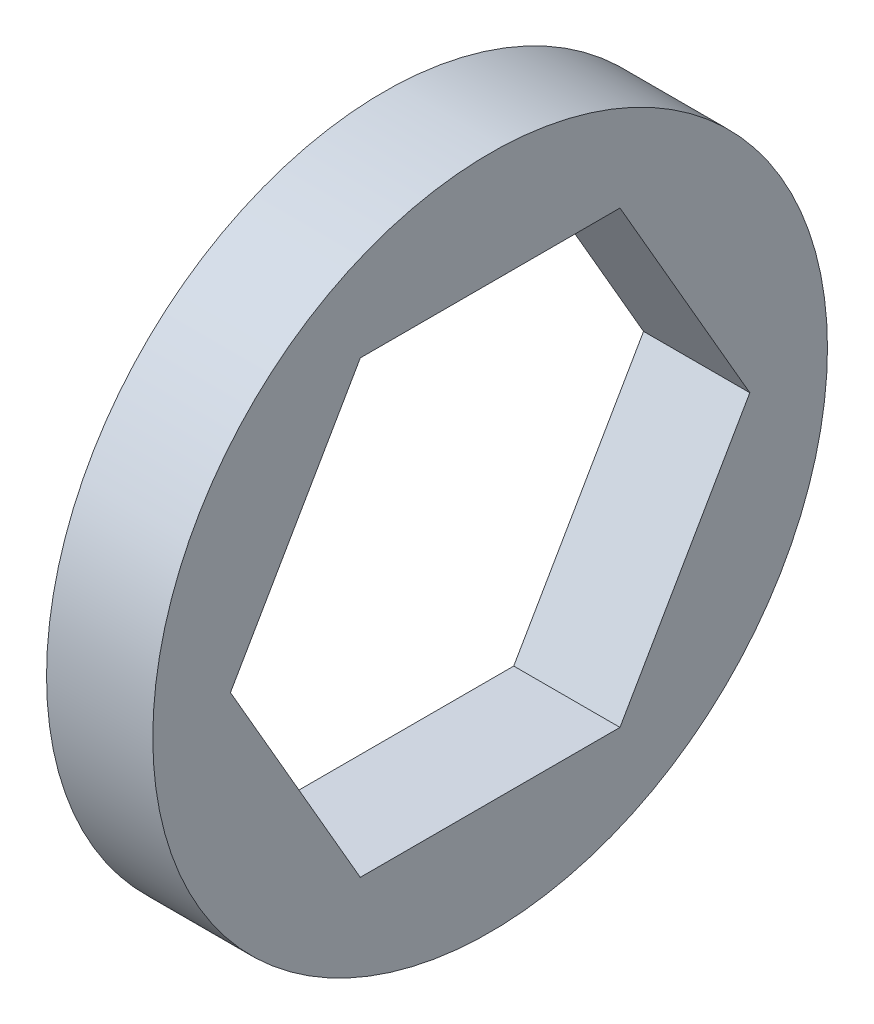
ISO-10303-21;
HEADER;
FILE_DESCRIPTION(('STEP AP214'),'2;1');
FILE_NAME('part.step','',(''),(''),'','','');
FILE_SCHEMA(('AUTOMOTIVE_DESIGN { 1 0 10303 214 1 1 1 1 }'));
ENDSEC;
DATA;
#1=APPLICATION_CONTEXT('core data for automotive mechanical design processes');
#2=APPLICATION_PROTOCOL_DEFINITION('international standard','automotive_design',2000,#1);
#3=PRODUCT_CONTEXT('',#1,'mechanical');
#4=PRODUCT('Part','Part','',(#3));
#5=PRODUCT_RELATED_PRODUCT_CATEGORY('part','',(#4));
#6=PRODUCT_DEFINITION_FORMATION('','',#4);
#7=PRODUCT_DEFINITION_CONTEXT('part definition',#1,'design');
#8=PRODUCT_DEFINITION('design','',#6,#7);
#9=PRODUCT_DEFINITION_SHAPE('','',#8);
#10=(LENGTH_UNIT() NAMED_UNIT(*) SI_UNIT(.MILLI.,.METRE.));
#11=(NAMED_UNIT(*) PLANE_ANGLE_UNIT() SI_UNIT($,.RADIAN.));
#12=(NAMED_UNIT(*) SI_UNIT($,.STERADIAN.) SOLID_ANGLE_UNIT());
#13=UNCERTAINTY_MEASURE_WITH_UNIT(LENGTH_MEASURE(1.E-05),#10,'distance_accuracy_value','');
#14=(GEOMETRIC_REPRESENTATION_CONTEXT(3) GLOBAL_UNCERTAINTY_ASSIGNED_CONTEXT((#13)) GLOBAL_UNIT_ASSIGNED_CONTEXT((#10,
#11,#12)) REPRESENTATION_CONTEXT('',''));
#15=CARTESIAN_POINT('',(0.,0.,0.));
#16=DIRECTION('',(0.,0.,1.));
#17=DIRECTION('',(1.,0.,0.));
#18=AXIS2_PLACEMENT_3D('',#15,#16,#17);
#19=CARTESIAN_POINT('',(1.5,0.,0.));
#20=DIRECTION('',(1.,0.,0.));
#21=DIRECTION('',(0.,0.,-1.));
#22=AXIS2_PLACEMENT_3D('',#19,#20,#21);
#23=PLANE('',#22);
#24=CARTESIAN_POINT('',(1.5,0.,0.));
#25=DIRECTION('',(1.,0.,0.));
#26=DIRECTION('',(0.,0.,-1.));
#27=AXIS2_PLACEMENT_3D('',#24,#25,#26);
#28=CIRCLE('',#27,9.52500000000001);
#29=CARTESIAN_POINT('',(1.5,0.,-9.52500000000001));
#30=VERTEX_POINT('',#29);
#31=EDGE_CURVE('E11',#30,#30,#28,.T.);
#32=ORIENTED_EDGE('',*,*,#31,.T.);
#33=EDGE_LOOP('',(#32));
#34=FACE_BOUND('',#33,.T.);
#35=DIRECTION('',(0.,0.866025403784441,0.499999999999996));
#36=VECTOR('',#35,1.);
#37=CARTESIAN_POINT('',(1.5,0.,-7.33234841870806));
#38=LINE('',#37,#36);
#39=CARTESIAN_POINT('',(1.5,0.,-7.33234841870806));
#40=VERTEX_POINT('',#39);
#41=CARTESIAN_POINT('',(1.5,6.35000000000008,-3.66617420935395));
#42=VERTEX_POINT('',#41);
#43=EDGE_CURVE('E95',#40,#42,#38,.T.);
#44=ORIENTED_EDGE('',*,*,#43,.F.);
#45=DIRECTION('',(0.,0.866025403784443,-0.499999999999992));
#46=VECTOR('',#45,1.);
#47=CARTESIAN_POINT('',(1.5,-6.34999999999999,-3.666174209354));
#48=LINE('',#47,#46);
#49=CARTESIAN_POINT('',(1.5,-6.34999999999999,-3.666174209354));
#50=VERTEX_POINT('',#49);
#51=EDGE_CURVE('E87',#50,#40,#48,.T.);
#52=ORIENTED_EDGE('',*,*,#51,.F.);
#53=DIRECTION('',(0.,0.,-1.));
#54=VECTOR('',#53,1.);
#55=CARTESIAN_POINT('',(1.5,-6.34999999999999,3.66617420935417));
#56=LINE('',#55,#54);
#57=CARTESIAN_POINT('',(1.5,-6.34999999999999,3.66617420935417));
#58=VERTEX_POINT('',#57);
#59=EDGE_CURVE('E115',#58,#50,#56,.T.);
#60=ORIENTED_EDGE('',*,*,#59,.F.);
#61=DIRECTION('',(0.,-0.866025403784438,-0.500000000000001));
#62=VECTOR('',#61,1.);
#63=CARTESIAN_POINT('',(1.5,0.,7.33234841870828));
#64=LINE('',#63,#62);
#65=CARTESIAN_POINT('',(1.5,0.,7.33234841870828));
#66=VERTEX_POINT('',#65);
#67=EDGE_CURVE('E113',#66,#58,#64,.T.);
#68=ORIENTED_EDGE('',*,*,#67,.F.);
#69=DIRECTION('',(0.,-0.86602540378444,0.499999999999998));
#70=VECTOR('',#69,1.);
#71=CARTESIAN_POINT('',(1.5,6.35000000000008,3.66617420935411));
#72=LINE('',#71,#70);
#73=CARTESIAN_POINT('',(1.5,6.35000000000008,3.66617420935411));
#74=VERTEX_POINT('',#73);
#75=EDGE_CURVE('E109',#74,#66,#72,.T.);
#76=ORIENTED_EDGE('',*,*,#75,.F.);
#77=DIRECTION('',(0.,0.,1.));
#78=VECTOR('',#77,1.);
#79=CARTESIAN_POINT('',(1.5,6.35000000000008,-3.66617420935395));
#80=LINE('',#79,#78);
#81=EDGE_CURVE('E107',#42,#74,#80,.T.);
#82=ORIENTED_EDGE('',*,*,#81,.F.);
#83=EDGE_LOOP('',(#44,#52,#60,#68,#76,#82));
#84=FACE_BOUND('',#83,.T.);
#85=ADVANCED_FACE('F34',(#34,#84),#23,.T.);
#86=CARTESIAN_POINT('',(-1.5,0.,0.));
#87=DIRECTION('',(1.,0.,0.));
#88=DIRECTION('',(0.,0.,-1.));
#89=AXIS2_PLACEMENT_3D('',#86,#87,#88);
#90=PLANE('',#89);
#91=CARTESIAN_POINT('',(-1.5,0.,0.));
#92=DIRECTION('',(1.,0.,0.));
#93=DIRECTION('',(0.,0.,-1.));
#94=AXIS2_PLACEMENT_3D('',#91,#92,#93);
#95=CIRCLE('',#94,9.52500000000001);
#96=CARTESIAN_POINT('',(-1.5,0.,-9.52500000000001));
#97=VERTEX_POINT('',#96);
#98=EDGE_CURVE('E38',#97,#97,#95,.T.);
#99=ORIENTED_EDGE('',*,*,#98,.F.);
#100=EDGE_LOOP('',(#99));
#101=FACE_BOUND('',#100,.T.);
#102=DIRECTION('',(0.,0.866025403784443,-0.499999999999992));
#103=VECTOR('',#102,1.);
#104=CARTESIAN_POINT('',(-1.5,-6.34999999999999,-3.666174209354));
#105=LINE('',#104,#103);
#106=CARTESIAN_POINT('',(-1.5,-6.34999999999999,-3.666174209354));
#107=VERTEX_POINT('',#106);
#108=CARTESIAN_POINT('',(-1.5,0.,-7.33234841870806));
#109=VERTEX_POINT('',#108);
#110=EDGE_CURVE('E57',#107,#109,#105,.T.);
#111=ORIENTED_EDGE('',*,*,#110,.T.);
#112=DIRECTION('',(0.,0.866025403784441,0.499999999999996));
#113=VECTOR('',#112,1.);
#114=CARTESIAN_POINT('',(-1.5,0.,-7.33234841870806));
#115=LINE('',#114,#113);
#116=CARTESIAN_POINT('',(-1.5,6.35000000000008,-3.66617420935395));
#117=VERTEX_POINT('',#116);
#118=EDGE_CURVE('E102',#109,#117,#115,.T.);
#119=ORIENTED_EDGE('',*,*,#118,.T.);
#120=DIRECTION('',(0.,0.,1.));
#121=VECTOR('',#120,1.);
#122=CARTESIAN_POINT('',(-1.5,6.35000000000008,-3.66617420935395));
#123=LINE('',#122,#121);
#124=CARTESIAN_POINT('',(-1.5,6.35000000000008,3.66617420935411));
#125=VERTEX_POINT('',#124);
#126=EDGE_CURVE('E119',#117,#125,#123,.T.);
#127=ORIENTED_EDGE('',*,*,#126,.T.);
#128=DIRECTION('',(0.,-0.86602540378444,0.499999999999998));
#129=VECTOR('',#128,1.);
#130=CARTESIAN_POINT('',(-1.5,6.35000000000008,3.66617420935411));
#131=LINE('',#130,#129);
#132=CARTESIAN_POINT('',(-1.5,0.,7.33234841870828));
#133=VERTEX_POINT('',#132);
#134=EDGE_CURVE('E122',#125,#133,#131,.T.);
#135=ORIENTED_EDGE('',*,*,#134,.T.);
#136=DIRECTION('',(0.,-0.866025403784438,-0.500000000000001));
#137=VECTOR('',#136,1.);
#138=CARTESIAN_POINT('',(-1.5,0.,7.33234841870828));
#139=LINE('',#138,#137);
#140=CARTESIAN_POINT('',(-1.5,-6.34999999999999,3.66617420935417));
#141=VERTEX_POINT('',#140);
#142=EDGE_CURVE('E125',#133,#141,#139,.T.);
#143=ORIENTED_EDGE('',*,*,#142,.T.);
#144=DIRECTION('',(0.,0.,-1.));
#145=VECTOR('',#144,1.);
#146=CARTESIAN_POINT('',(-1.5,-6.34999999999999,3.66617420935417));
#147=LINE('',#146,#145);
#148=EDGE_CURVE('E96',#141,#107,#147,.T.);
#149=ORIENTED_EDGE('',*,*,#148,.T.);
#150=EDGE_LOOP('',(#111,#119,#127,#135,#143,#149));
#151=FACE_BOUND('',#150,.T.);
#152=ADVANCED_FACE('F142',(#101,#151),#90,.F.);
#153=CARTESIAN_POINT('',(1.5,0.,0.));
#154=DIRECTION('',(-1.,0.,0.));
#155=DIRECTION('',(0.,0.,1.));
#156=AXIS2_PLACEMENT_3D('',#153,#154,#155);
#157=CYLINDRICAL_SURFACE('',#156,9.52500000000001);
#158=ORIENTED_EDGE('',*,*,#31,.F.);
#159=EDGE_LOOP('',(#158));
#160=FACE_BOUND('',#159,.T.);
#161=ORIENTED_EDGE('',*,*,#98,.T.);
#162=EDGE_LOOP('',(#161));
#163=FACE_BOUND('',#162,.T.);
#164=ADVANCED_FACE('F36',(#160,#163),#157,.T.);
#165=CARTESIAN_POINT('',(1.5,-6.34999999999999,-3.666174209354));
#166=DIRECTION('',(0.,0.499999999999992,0.866025403784443));
#167=DIRECTION('',(0.,-0.866025403784443,0.499999999999992));
#168=AXIS2_PLACEMENT_3D('',#165,#166,#167);
#169=PLANE('',#168);
#170=ORIENTED_EDGE('',*,*,#110,.F.);
#171=DIRECTION('',(-1.,0.,0.));
#172=VECTOR('',#171,1.);
#173=CARTESIAN_POINT('',(1.5,-6.34999999999999,-3.666174209354));
#174=LINE('',#173,#172);
#175=EDGE_CURVE('E91',#50,#107,#174,.T.);
#176=ORIENTED_EDGE('',*,*,#175,.F.);
#177=ORIENTED_EDGE('',*,*,#51,.T.);
#178=DIRECTION('',(-1.,0.,0.));
#179=VECTOR('',#178,1.);
#180=CARTESIAN_POINT('',(1.5,0.,-7.33234841870806));
#181=LINE('',#180,#179);
#182=EDGE_CURVE('E90',#40,#109,#181,.T.);
#183=ORIENTED_EDGE('',*,*,#182,.T.);
#184=EDGE_LOOP('',(#170,#176,#177,#183));
#185=FACE_BOUND('',#184,.T.);
#186=ADVANCED_FACE('F89',(#185),#169,.T.);
#187=CARTESIAN_POINT('',(1.5,0.,-7.33234841870806));
#188=DIRECTION('',(0.,-0.499999999999996,0.866025403784441));
#189=DIRECTION('',(0.,-0.866025403784441,-0.499999999999996));
#190=AXIS2_PLACEMENT_3D('',#187,#188,#189);
#191=PLANE('',#190);
#192=ORIENTED_EDGE('',*,*,#118,.F.);
#193=ORIENTED_EDGE('',*,*,#182,.F.);
#194=ORIENTED_EDGE('',*,*,#43,.T.);
#195=DIRECTION('',(-1.,0.,0.));
#196=VECTOR('',#195,1.);
#197=CARTESIAN_POINT('',(1.5,6.35000000000008,-3.66617420935395));
#198=LINE('',#197,#196);
#199=EDGE_CURVE('E103',#42,#117,#198,.T.);
#200=ORIENTED_EDGE('',*,*,#199,.T.);
#201=EDGE_LOOP('',(#192,#193,#194,#200));
#202=FACE_BOUND('',#201,.T.);
#203=ADVANCED_FACE('F99',(#202),#191,.T.);
#204=CARTESIAN_POINT('',(1.5,6.35000000000008,-3.66617420935395));
#205=DIRECTION('',(0.,-1.,0.));
#206=DIRECTION('',(0.,0.,-1.));
#207=AXIS2_PLACEMENT_3D('',#204,#205,#206);
#208=PLANE('',#207);
#209=ORIENTED_EDGE('',*,*,#126,.F.);
#210=ORIENTED_EDGE('',*,*,#199,.F.);
#211=ORIENTED_EDGE('',*,*,#81,.T.);
#212=DIRECTION('',(-1.,0.,0.));
#213=VECTOR('',#212,1.);
#214=CARTESIAN_POINT('',(1.5,6.35000000000008,3.66617420935411));
#215=LINE('',#214,#213);
#216=EDGE_CURVE('E134',#74,#125,#215,.T.);
#217=ORIENTED_EDGE('',*,*,#216,.T.);
#218=EDGE_LOOP('',(#209,#210,#211,#217));
#219=FACE_BOUND('',#218,.T.);
#220=ADVANCED_FACE('F138',(#219),#208,.T.);
#221=CARTESIAN_POINT('',(1.5,6.35000000000008,3.66617420935411));
#222=DIRECTION('',(0.,-0.499999999999998,-0.86602540378444));
#223=DIRECTION('',(0.,0.86602540378444,-0.499999999999998));
#224=AXIS2_PLACEMENT_3D('',#221,#222,#223);
#225=PLANE('',#224);
#226=ORIENTED_EDGE('',*,*,#134,.F.);
#227=ORIENTED_EDGE('',*,*,#216,.F.);
#228=ORIENTED_EDGE('',*,*,#75,.T.);
#229=DIRECTION('',(-1.,0.,0.));
#230=VECTOR('',#229,1.);
#231=CARTESIAN_POINT('',(1.5,0.,7.33234841870828));
#232=LINE('',#231,#230);
#233=EDGE_CURVE('E132',#66,#133,#232,.T.);
#234=ORIENTED_EDGE('',*,*,#233,.T.);
#235=EDGE_LOOP('',(#226,#227,#228,#234));
#236=FACE_BOUND('',#235,.T.);
#237=ADVANCED_FACE('F150',(#236),#225,.T.);
#238=CARTESIAN_POINT('',(1.5,0.,7.33234841870828));
#239=DIRECTION('',(0.,0.500000000000001,-0.866025403784438));
#240=DIRECTION('',(0.,0.866025403784438,0.500000000000001));
#241=AXIS2_PLACEMENT_3D('',#238,#239,#240);
#242=PLANE('',#241);
#243=ORIENTED_EDGE('',*,*,#142,.F.);
#244=ORIENTED_EDGE('',*,*,#233,.F.);
#245=ORIENTED_EDGE('',*,*,#67,.T.);
#246=DIRECTION('',(-1.,0.,0.));
#247=VECTOR('',#246,1.);
#248=CARTESIAN_POINT('',(1.5,-6.34999999999999,3.66617420935417));
#249=LINE('',#248,#247);
#250=EDGE_CURVE('E49',#58,#141,#249,.T.);
#251=ORIENTED_EDGE('',*,*,#250,.T.);
#252=EDGE_LOOP('',(#243,#244,#245,#251));
#253=FACE_BOUND('',#252,.T.);
#254=ADVANCED_FACE('F148',(#253),#242,.T.);
#255=CARTESIAN_POINT('',(1.5,-6.34999999999999,3.66617420935417));
#256=DIRECTION('',(0.,1.,0.));
#257=DIRECTION('',(0.,0.,1.));
#258=AXIS2_PLACEMENT_3D('',#255,#256,#257);
#259=PLANE('',#258);
#260=ORIENTED_EDGE('',*,*,#148,.F.);
#261=ORIENTED_EDGE('',*,*,#250,.F.);
#262=ORIENTED_EDGE('',*,*,#59,.T.);
#263=ORIENTED_EDGE('',*,*,#175,.T.);
#264=EDGE_LOOP('',(#260,#261,#262,#263));
#265=FACE_BOUND('',#264,.T.);
#266=ADVANCED_FACE('F144',(#265),#259,.T.);
#267=CLOSED_SHELL('',(#85,#152,#164,#186,#203,#220,#237,#254,#266));
#268=MANIFOLD_SOLID_BREP('B2',#267);
#269=ADVANCED_BREP_SHAPE_REPRESENTATION('',(#18,#268),#14);
#270=SHAPE_DEFINITION_REPRESENTATION(#9,#269);
ENDSEC;
END-ISO-10303-21;
